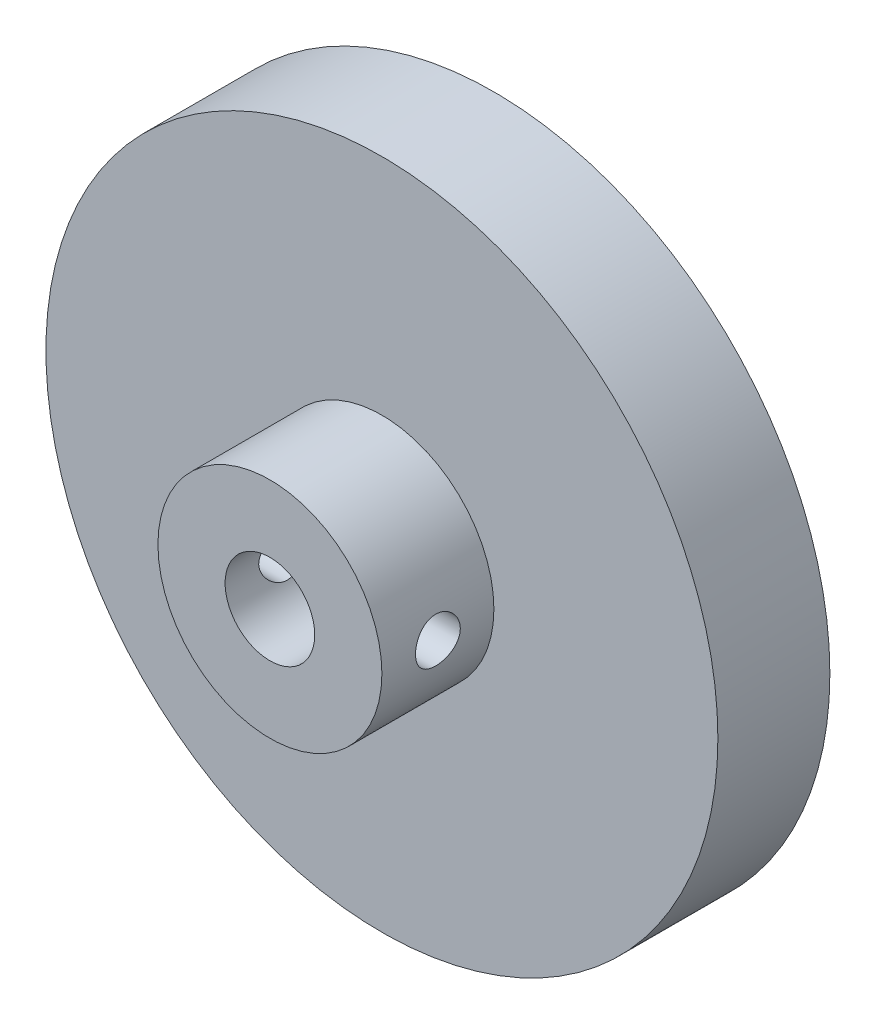
ISO-10303-21;
HEADER;
FILE_DESCRIPTION(('STEP AP214'),'2;1');
FILE_NAME('part.step','',(''),(''),'','','');
FILE_SCHEMA(('AUTOMOTIVE_DESIGN { 1 0 10303 214 1 1 1 1 }'));
ENDSEC;
DATA;
#1=APPLICATION_CONTEXT('core data for automotive mechanical design processes');
#2=APPLICATION_PROTOCOL_DEFINITION('international standard','automotive_design',2000,#1);
#3=PRODUCT_CONTEXT('',#1,'mechanical');
#4=PRODUCT('Part','Part','',(#3));
#5=PRODUCT_RELATED_PRODUCT_CATEGORY('part','',(#4));
#6=PRODUCT_DEFINITION_FORMATION('','',#4);
#7=PRODUCT_DEFINITION_CONTEXT('part definition',#1,'design');
#8=PRODUCT_DEFINITION('design','',#6,#7);
#9=PRODUCT_DEFINITION_SHAPE('','',#8);
#10=(LENGTH_UNIT() NAMED_UNIT(*) SI_UNIT(.MILLI.,.METRE.));
#11=(NAMED_UNIT(*) PLANE_ANGLE_UNIT() SI_UNIT($,.RADIAN.));
#12=(NAMED_UNIT(*) SI_UNIT($,.STERADIAN.) SOLID_ANGLE_UNIT());
#13=UNCERTAINTY_MEASURE_WITH_UNIT(LENGTH_MEASURE(1.E-05),#10,'distance_accuracy_value','');
#14=(GEOMETRIC_REPRESENTATION_CONTEXT(3) GLOBAL_UNCERTAINTY_ASSIGNED_CONTEXT((#13)) GLOBAL_UNIT_ASSIGNED_CONTEXT((#10,
#11,#12)) REPRESENTATION_CONTEXT('',''));
#15=CARTESIAN_POINT('',(0.,0.,0.));
#16=DIRECTION('',(0.,0.,1.));
#17=DIRECTION('',(1.,0.,0.));
#18=AXIS2_PLACEMENT_3D('',#15,#16,#17);
#19=CARTESIAN_POINT('',(0.,0.,20.));
#20=DIRECTION('',(0.,0.,-1.));
#21=DIRECTION('',(-1.,0.,0.));
#22=AXIS2_PLACEMENT_3D('',#19,#20,#21);
#23=CYLINDRICAL_SURFACE('',#22,10.);
#24=CARTESIAN_POINT('',(0.,0.,20.));
#25=DIRECTION('',(0.,0.,1.));
#26=DIRECTION('',(1.,0.,0.));
#27=AXIS2_PLACEMENT_3D('',#24,#25,#26);
#28=CIRCLE('',#27,10.);
#29=CARTESIAN_POINT('',(10.,0.,20.));
#30=VERTEX_POINT('',#29);
#31=EDGE_CURVE('E52',#30,#30,#28,.T.);
#32=ORIENTED_EDGE('',*,*,#31,.F.);
#33=EDGE_LOOP('',(#32));
#34=FACE_BOUND('',#33,.T.);
#35=CARTESIAN_POINT('',(0.,0.,10.));
#36=DIRECTION('',(0.,0.,1.));
#37=DIRECTION('',(1.,0.,0.));
#38=AXIS2_PLACEMENT_3D('',#35,#36,#37);
#39=CIRCLE('',#38,10.);
#40=CARTESIAN_POINT('',(10.,0.,10.));
#41=VERTEX_POINT('',#40);
#42=EDGE_CURVE('E10',#41,#41,#39,.T.);
#43=ORIENTED_EDGE('',*,*,#42,.T.);
#44=EDGE_LOOP('',(#43));
#45=FACE_BOUND('',#44,.T.);
#46=CARTESIAN_POINT('',(-10.,0.,17.));
#47=CARTESIAN_POINT('',(-9.99999795161742,0.111153813585266,16.9999959110033));
#48=CARTESIAN_POINT('',(-9.99812770356462,0.222359320403044,16.9907023140647));
#49=CARTESIAN_POINT('',(-9.99084731246463,0.441627015378038,16.9538029997695));
#50=CARTESIAN_POINT('',(-9.98543435720372,0.549686635082711,16.926182734397));
#51=CARTESIAN_POINT('',(-9.97167298556573,0.759460610526624,16.8535174527584));
#52=CARTESIAN_POINT('',(-9.96332738153436,0.861180935866266,16.8084891263106));
#53=CARTESIAN_POINT('',(-9.94460796070629,1.05561597772845,16.7023355049774));
#54=CARTESIAN_POINT('',(-9.93423426471414,1.14833123015162,16.6412111687856));
#55=CARTESIAN_POINT('',(-9.9124433065994,1.32338695462973,16.5037230114171));
#56=CARTESIAN_POINT('',(-9.90101491008695,1.40558790231705,16.4271832892176));
#57=CARTESIAN_POINT('',(-9.87848360905177,1.55607351321605,16.2614151672166));
#58=CARTESIAN_POINT('',(-9.86738073000848,1.62435708954085,16.1721857773298));
#59=CARTESIAN_POINT('',(-9.8466488362523,1.74566350669524,15.9825676139763));
#60=CARTESIAN_POINT('',(-9.83703414729892,1.79854187773173,15.8820847124073));
#61=CARTESIAN_POINT('',(-9.82052536116836,1.88661133316062,15.6734363619918));
#62=CARTESIAN_POINT('',(-9.81363099523923,1.92180416487447,15.5652716733073));
#63=CARTESIAN_POINT('',(-9.80345610504409,1.97305059976965,15.3458312721842));
#64=CARTESIAN_POINT('',(-9.80012940214375,1.98934899591755,15.2346149117155));
#65=CARTESIAN_POINT('',(-9.79732750121254,2.00310425545224,15.0109803572713));
#66=CARTESIAN_POINT('',(-9.79785190935681,2.000563045427,14.8985622873597));
#67=CARTESIAN_POINT('',(-9.80265102296369,1.97690914620364,14.677506423958));
#68=CARTESIAN_POINT('',(-9.80686905717527,1.95607708048781,14.5688371887454));
#69=CARTESIAN_POINT('',(-9.81849092320002,1.8968757692461,14.356567846674));
#70=CARTESIAN_POINT('',(-9.82589490715558,1.85850568620136,14.252967982162));
#71=CARTESIAN_POINT('',(-9.84311237000816,1.76504956734944,14.0529694765928));
#72=CARTESIAN_POINT('',(-9.85294179627409,1.70985230246423,13.9566242408617));
#73=CARTESIAN_POINT('',(-9.87389237546124,1.58438714914536,13.7744583000544));
#74=CARTESIAN_POINT('',(-9.88501367676732,1.51411752871366,13.6886388062977));
#75=CARTESIAN_POINT('',(-9.90754042482924,1.35899986912117,13.5283411950861));
#76=CARTESIAN_POINT('',(-9.9189473842181,1.27391232242489,13.4540948642817));
#77=CARTESIAN_POINT('',(-9.94057697428817,1.09237004812402,13.3208923073976));
#78=CARTESIAN_POINT('',(-9.95079958977947,0.99591517475878,13.2619362774128));
#79=CARTESIAN_POINT('',(-9.96893380321774,0.794118773757843,13.1609449815481));
#80=CARTESIAN_POINT('',(-9.97684177696544,0.688763639170601,13.1189362127109));
#81=CARTESIAN_POINT('',(-9.98942817975716,0.472297952897331,13.0532790519229));
#82=CARTESIAN_POINT('',(-9.99410700001063,0.3611881001449,13.0296284358527));
#83=CARTESIAN_POINT('',(-9.99965343733735,0.138358811254302,13.0016870924114));
#84=CARTESIAN_POINT('',(-10.0005834930494,0.0266806566511538,12.9970791609195));
#85=CARTESIAN_POINT('',(-9.99870103860205,-0.195849868385427,13.0064997178844));
#86=CARTESIAN_POINT('',(-9.99588873882892,-0.306702284887585,13.0205271587052));
#87=CARTESIAN_POINT('',(-9.98687664016035,-0.52341131989308,13.0665567470879));
#88=CARTESIAN_POINT('',(-9.98070752808413,-0.629303896679805,13.0983961369958));
#89=CARTESIAN_POINT('',(-9.96567104122065,-0.834247254999333,13.1789679653116));
#90=CARTESIAN_POINT('',(-9.95680346428454,-0.933297523275078,13.2277016693537));
#91=CARTESIAN_POINT('',(-9.93719823066589,-1.12308234737243,13.3413649813026));
#92=CARTESIAN_POINT('',(-9.92643900874104,-1.21370025350437,13.4064855620779));
#93=CARTESIAN_POINT('',(-9.90429469659765,-1.38283603823841,13.5508183824146));
#94=CARTESIAN_POINT('',(-9.89290953936776,-1.46135261786152,13.6300321327997));
#95=CARTESIAN_POINT('',(-9.8705860711393,-1.60528118154835,13.8017467037822));
#96=CARTESIAN_POINT('',(-9.85965720466609,-1.67047540489731,13.8944314884427));
#97=CARTESIAN_POINT('',(-9.83968383592389,-1.78437084010241,14.0896227227134));
#98=CARTESIAN_POINT('',(-9.83063925826685,-1.8330727118458,14.1921287791471));
#99=CARTESIAN_POINT('',(-9.81553481168766,-1.91230368316392,14.4035364922991));
#100=CARTESIAN_POINT('',(-9.80945949744373,-1.9429269995821,14.5124016824206));
#101=CARTESIAN_POINT('',(-9.8009487358405,-1.98541730325439,14.7338669069818));
#102=CARTESIAN_POINT('',(-9.79851281382223,-1.99728673645022,14.8464664524187));
#103=CARTESIAN_POINT('',(-9.79758299262758,-2.00184182173494,15.0700177290886));
#104=CARTESIAN_POINT('',(-9.79901838378602,-1.99487157614179,15.180962297854));
#105=CARTESIAN_POINT('',(-9.80551146969228,-1.96270460820012,15.4000632998101));
#106=CARTESIAN_POINT('',(-9.81056913534338,-1.9375080322586,15.5082197553896));
#107=CARTESIAN_POINT('',(-9.82370528438317,-1.86975713699791,15.7184554224811));
#108=CARTESIAN_POINT('',(-9.83177642037661,-1.82724501343469,15.8205487210048));
#109=CARTESIAN_POINT('',(-9.85003429948341,-1.72610928920321,16.0162074414689));
#110=CARTESIAN_POINT('',(-9.86022121997788,-1.66748433754976,16.1097721474503));
#111=CARTESIAN_POINT('',(-9.88177921046451,-1.53461182957283,16.2874311443006));
#112=CARTESIAN_POINT('',(-9.89316745819399,-1.46011577447036,16.3713375305352));
#113=CARTESIAN_POINT('',(-9.91572163743909,-1.29812873802628,16.5255724110583));
#114=CARTESIAN_POINT('',(-9.92688751726369,-1.21063477430667,16.5958977806345));
#115=CARTESIAN_POINT('',(-9.94787664775943,-1.02403525817649,16.7216692878929));
#116=CARTESIAN_POINT('',(-9.95768462438492,-0.924817768859669,16.77695200656));
#117=CARTESIAN_POINT('',(-9.9747025017,-0.718332721881465,16.8699722451932));
#118=CARTESIAN_POINT('',(-9.98191474277232,-0.611072521726253,16.907725579065));
#119=CARTESIAN_POINT('',(-9.99152745190741,-0.41964297784756,16.9573038960894));
#120=CARTESIAN_POINT('',(-9.99468606316903,-0.33656332802757,16.9732863874155));
#121=CARTESIAN_POINT('',(-9.99892308279786,-0.168999050420134,16.9946358247167));
#122=CARTESIAN_POINT('',(-10.0000015574631,-0.0845144674972381,17.0000031090195));
#123=CARTESIAN_POINT('',(-10.,0.,17.));
#124=B_SPLINE_CURVE_WITH_KNOTS('',3,(#46,#47,#48,#49,#50,#51,#52,#53,#54,#55,#56,#57,#58,#59,
#60,#61,#62,#63,#64,#65,#66,#67,#68,#69,#70,#71,#72,#73,#74,#75,#76,#77,#78,#79,#80,#81,#82,#83,
#84,#85,#86,#87,#88,#89,#90,#91,#92,#93,#94,#95,#96,#97,#98,#99,#100,#101,#102,#103,#104,#105,
#106,#107,#108,#109,#110,#111,#112,#113,#114,#115,#116,#117,#118,#119,#120,#121,#122,#123),
.UNSPECIFIED.,.T.,.F.,(4,2,2,2,2,2,2,2,2,2,2,2,2,2,2,2,2,2,2,2,2,2,2,2,2,2,2,2,2,2,2,2,2,2,2,2,
2,2,4),(0.,0.333152261322516,0.666569301382645,0.99966747050068,1.33274580446172,
1.66986534022437,2.00701119349473,2.34722390011845,2.68740298730395,3.02312370207174,
3.3588100856245,3.68943454012556,4.02007478507459,4.35294980407185,4.68586309499341,
5.02476504982701,5.3636713507964,5.70310549708047,6.04249851396072,6.3762147135253,
6.70991215315735,7.04060907901447,7.37133078432045,7.70610132066717,8.0409077669186,
8.38081257158451,8.72070377446932,9.05880762065446,9.39686736660829,9.72879445135402,
10.0607188698522,10.3918392250622,10.7229873516373,11.0597615247829,11.3966130906586,
11.7369899335127,12.0770591103504,12.3303755057979,12.5836838274199),.UNSPECIFIED.);
#125=CARTESIAN_POINT('',(-10.,0.,17.));
#126=VERTEX_POINT('',#125);
#127=EDGE_CURVE('E75',#126,#126,#124,.T.);
#128=ORIENTED_EDGE('',*,*,#127,.F.);
#129=EDGE_LOOP('',(#128));
#130=FACE_BOUND('',#129,.T.);
#131=CARTESIAN_POINT('',(10.,0.,17.));
#132=CARTESIAN_POINT('',(9.99999795161742,-0.111153813585266,16.9999959110033));
#133=CARTESIAN_POINT('',(9.99812770356462,-0.222359320403045,16.9907023140647));
#134=CARTESIAN_POINT('',(9.99084731246463,-0.441627015378038,16.9538029997695));
#135=CARTESIAN_POINT('',(9.98543435720372,-0.549686635082711,16.926182734397));
#136=CARTESIAN_POINT('',(9.97167298556573,-0.759460610526624,16.8535174527584));
#137=CARTESIAN_POINT('',(9.96332738153436,-0.861180935866266,16.8084891263106));
#138=CARTESIAN_POINT('',(9.94460796070629,-1.05561597772845,16.7023355049774));
#139=CARTESIAN_POINT('',(9.93423426471414,-1.14833123015162,16.6412111687856));
#140=CARTESIAN_POINT('',(9.9124433065994,-1.32338695462973,16.5037230114171));
#141=CARTESIAN_POINT('',(9.90101491008695,-1.40558790231705,16.4271832892176));
#142=CARTESIAN_POINT('',(9.87848360905177,-1.55607351321605,16.2614151672166));
#143=CARTESIAN_POINT('',(9.86738073000848,-1.62435708954085,16.1721857773298));
#144=CARTESIAN_POINT('',(9.8466488362523,-1.74566350669524,15.9825676139763));
#145=CARTESIAN_POINT('',(9.83703414729892,-1.79854187773173,15.8820847124073));
#146=CARTESIAN_POINT('',(9.82052536116836,-1.88661133316062,15.6734363619918));
#147=CARTESIAN_POINT('',(9.81363099523923,-1.92180416487447,15.5652716733073));
#148=CARTESIAN_POINT('',(9.80345610504409,-1.97305059976965,15.3458312721842));
#149=CARTESIAN_POINT('',(9.80012940214375,-1.98934899591755,15.2346149117155));
#150=CARTESIAN_POINT('',(9.79732750121254,-2.00310425545224,15.0109803572713));
#151=CARTESIAN_POINT('',(9.79785190935681,-2.000563045427,14.8985622873597));
#152=CARTESIAN_POINT('',(9.80265102296369,-1.97690914620364,14.677506423958));
#153=CARTESIAN_POINT('',(9.80686905717527,-1.95607708048781,14.5688371887454));
#154=CARTESIAN_POINT('',(9.81849092320002,-1.8968757692461,14.356567846674));
#155=CARTESIAN_POINT('',(9.82589490715558,-1.85850568620136,14.252967982162));
#156=CARTESIAN_POINT('',(9.84311237000816,-1.76504956734944,14.0529694765928));
#157=CARTESIAN_POINT('',(9.85294179627409,-1.70985230246423,13.9566242408617));
#158=CARTESIAN_POINT('',(9.87389237546124,-1.58438714914536,13.7744583000544));
#159=CARTESIAN_POINT('',(9.88501367676732,-1.51411752871366,13.6886388062977));
#160=CARTESIAN_POINT('',(9.90754042482924,-1.35899986912117,13.5283411950861));
#161=CARTESIAN_POINT('',(9.9189473842181,-1.27391232242489,13.4540948642817));
#162=CARTESIAN_POINT('',(9.94057697428817,-1.09237004812402,13.3208923073976));
#163=CARTESIAN_POINT('',(9.95079958977947,-0.995915174758779,13.2619362774128));
#164=CARTESIAN_POINT('',(9.96893380321774,-0.794118773757842,13.1609449815481));
#165=CARTESIAN_POINT('',(9.97684177696544,-0.688763639170601,13.1189362127109));
#166=CARTESIAN_POINT('',(9.98942817975716,-0.472297952897331,13.0532790519229));
#167=CARTESIAN_POINT('',(9.99410700001063,-0.3611881001449,13.0296284358527));
#168=CARTESIAN_POINT('',(9.99965343733735,-0.138358811254302,13.0016870924114));
#169=CARTESIAN_POINT('',(10.0005834930494,-0.0266806566511532,12.9970791609195));
#170=CARTESIAN_POINT('',(9.99870103860205,0.195849868385427,13.0064997178844));
#171=CARTESIAN_POINT('',(9.99588873882892,0.306702284887585,13.0205271587052));
#172=CARTESIAN_POINT('',(9.98687664016035,0.52341131989308,13.0665567470879));
#173=CARTESIAN_POINT('',(9.98070752808413,0.629303896679805,13.0983961369958));
#174=CARTESIAN_POINT('',(9.96567104122065,0.834247254999333,13.1789679653116));
#175=CARTESIAN_POINT('',(9.95680346428454,0.933297523275078,13.2277016693537));
#176=CARTESIAN_POINT('',(9.93719823066589,1.12308234737243,13.3413649813026));
#177=CARTESIAN_POINT('',(9.92643900874103,1.21370025350438,13.4064855620779));
#178=CARTESIAN_POINT('',(9.90429469659765,1.38283603823841,13.5508183824146));
#179=CARTESIAN_POINT('',(9.89290953936776,1.46135261786152,13.6300321327997));
#180=CARTESIAN_POINT('',(9.8705860711393,1.60528118154835,13.8017467037822));
#181=CARTESIAN_POINT('',(9.85965720466609,1.67047540489731,13.8944314884427));
#182=CARTESIAN_POINT('',(9.83968383592389,1.78437084010241,14.0896227227134));
#183=CARTESIAN_POINT('',(9.83063925826685,1.8330727118458,14.1921287791471));
#184=CARTESIAN_POINT('',(9.81553481168766,1.91230368316392,14.4035364922991));
#185=CARTESIAN_POINT('',(9.80945949744373,1.9429269995821,14.5124016824206));
#186=CARTESIAN_POINT('',(9.8009487358405,1.98541730325439,14.7338669069818));
#187=CARTESIAN_POINT('',(9.79851281382223,1.99728673645022,14.8464664524187));
#188=CARTESIAN_POINT('',(9.79758299262758,2.00184182173494,15.0700177290886));
#189=CARTESIAN_POINT('',(9.79901838378602,1.99487157614179,15.180962297854));
#190=CARTESIAN_POINT('',(9.80551146969228,1.96270460820012,15.40006329981));
#191=CARTESIAN_POINT('',(9.81056913534338,1.9375080322586,15.5082197553896));
#192=CARTESIAN_POINT('',(9.82370528438317,1.86975713699791,15.7184554224811));
#193=CARTESIAN_POINT('',(9.83177642037661,1.82724501343469,15.8205487210048));
#194=CARTESIAN_POINT('',(9.85003429948341,1.72610928920321,16.0162074414689));
#195=CARTESIAN_POINT('',(9.86022121997788,1.66748433754976,16.1097721474503));
#196=CARTESIAN_POINT('',(9.88177921046451,1.53461182957283,16.2874311443006));
#197=CARTESIAN_POINT('',(9.89316745819399,1.46011577447036,16.3713375305352));
#198=CARTESIAN_POINT('',(9.91572163743909,1.29812873802628,16.5255724110583));
#199=CARTESIAN_POINT('',(9.92688751726369,1.21063477430667,16.5958977806345));
#200=CARTESIAN_POINT('',(9.94787664775943,1.02403525817649,16.7216692878929));
#201=CARTESIAN_POINT('',(9.95768462438492,0.924817768859669,16.77695200656));
#202=CARTESIAN_POINT('',(9.9747025017,0.718332721881465,16.8699722451932));
#203=CARTESIAN_POINT('',(9.98191474277232,0.611072521726253,16.907725579065));
#204=CARTESIAN_POINT('',(9.99152745190741,0.41964297784756,16.9573038960894));
#205=CARTESIAN_POINT('',(9.99468606316904,0.33656332802757,16.9732863874155));
#206=CARTESIAN_POINT('',(9.99892308279786,0.168999050420134,16.9946358247167));
#207=CARTESIAN_POINT('',(10.0000015574631,0.0845144674972381,17.0000031090195));
#208=CARTESIAN_POINT('',(10.,0.,17.));
#209=B_SPLINE_CURVE_WITH_KNOTS('',3,(#131,#132,#133,#134,#135,#136,#137,#138,#139,#140,#141,
#142,#143,#144,#145,#146,#147,#148,#149,#150,#151,#152,#153,#154,#155,#156,#157,#158,#159,#160,
#161,#162,#163,#164,#165,#166,#167,#168,#169,#170,#171,#172,#173,#174,#175,#176,#177,#178,#179,
#180,#181,#182,#183,#184,#185,#186,#187,#188,#189,#190,#191,#192,#193,#194,#195,#196,#197,#198,
#199,#200,#201,#202,#203,#204,#205,#206,#207,#208),.UNSPECIFIED.,.T.,.F.,(4,2,2,2,2,2,2,2,2,2,2,
2,2,2,2,2,2,2,2,2,2,2,2,2,2,2,2,2,2,2,2,2,2,2,2,2,2,2,4),(0.,0.333152261322517,
0.666569301382645,0.999667470500681,1.33274580446172,1.66986534022437,2.00701119349473,
2.34722390011845,2.68740298730395,3.02312370207174,3.3588100856245,3.68943454012556,
4.02007478507459,4.35294980407185,4.68586309499341,5.02476504982701,5.3636713507964,
5.70310549708047,6.04249851396072,6.3762147135253,6.70991215315735,7.04060907901446,
7.37133078432045,7.70610132066717,8.0409077669186,8.38081257158451,8.72070377446933,
9.05880762065446,9.39686736660829,9.72879445135402,10.0607188698522,10.3918392250622,
10.7229873516373,11.0597615247829,11.3966130906586,11.7369899335127,12.0770591103504,
12.3303755057979,12.5836838274199),.UNSPECIFIED.);
#210=CARTESIAN_POINT('',(10.,0.,17.));
#211=VERTEX_POINT('',#210);
#212=EDGE_CURVE('E81',#211,#211,#209,.T.);
#213=ORIENTED_EDGE('',*,*,#212,.F.);
#214=EDGE_LOOP('',(#213));
#215=FACE_BOUND('',#214,.T.);
#216=ADVANCED_FACE('F31',(#34,#45,#130,#215),#23,.T.);
#217=CARTESIAN_POINT('',(0.,0.,20.));
#218=DIRECTION('',(0.,0.,-1.));
#219=DIRECTION('',(-1.,0.,0.));
#220=AXIS2_PLACEMENT_3D('',#217,#218,#219);
#221=CYLINDRICAL_SURFACE('',#220,4.);
#222=CARTESIAN_POINT('',(4.,0.,17.));
#223=CARTESIAN_POINT('',(3.99999426810082,-0.105143925902467,16.9999933953656));
#224=CARTESIAN_POINT('',(3.99580982039513,-0.210413199395125,16.9916598537579));
#225=CARTESIAN_POINT('',(3.97948312074314,-0.417840470537792,16.9586942393169));
#226=CARTESIAN_POINT('',(3.96732575657839,-0.519992173427259,16.9340312140044));
#227=CARTESIAN_POINT('',(3.93632558806751,-0.717867089760897,16.8696123827667));
#228=CARTESIAN_POINT('',(3.91750878355075,-0.813613605878292,16.8299152315041));
#229=CARTESIAN_POINT('',(3.87491553031523,-0.996945233613197,16.73685875727));
#230=CARTESIAN_POINT('',(3.8511394726705,-1.08453098798012,16.6835005115023));
#231=CARTESIAN_POINT('',(3.79912516516124,-1.25501563552382,16.5609655010294));
#232=CARTESIAN_POINT('',(3.77070398255074,-1.33731042224422,16.4910270415207));
#233=CARTESIAN_POINT('',(3.71319940493486,-1.48955888973396,16.3389570415059));
#234=CARTESIAN_POINT('',(3.68411552418069,-1.55950316621353,16.2568162964551));
#235=CARTESIAN_POINT('',(3.62597902394695,-1.69050400090055,16.0750333009532));
#236=CARTESIAN_POINT('',(3.59710373940264,-1.75045067110327,15.9745278033082));
#237=CARTESIAN_POINT('',(3.54571957544641,-1.85233645378139,15.7632653280276));
#238=CARTESIAN_POINT('',(3.52320615213979,-1.89428842993267,15.6525157425545));
#239=CARTESIAN_POINT('',(3.48915734075617,-1.95626488437718,15.4306697891562));
#240=CARTESIAN_POINT('',(3.47704543167427,-1.97745171416088,15.3199910958652));
#241=CARTESIAN_POINT('',(3.46363779897055,-2.00085398661769,15.096042324441));
#242=CARTESIAN_POINT('',(3.46233138686576,-2.00308817674615,14.9827749182577));
#243=CARTESIAN_POINT('',(3.47021860514497,-1.98937457434459,14.7714279513693));
#244=CARTESIAN_POINT('',(3.47817527324027,-1.97556911907364,14.6731519375539));
#245=CARTESIAN_POINT('',(3.50152457467701,-1.93387969811386,14.4805561812539));
#246=CARTESIAN_POINT('',(3.51691957663553,-1.9059912477953,14.3862377093894));
#247=CARTESIAN_POINT('',(3.55374952825482,-1.83641956077201,14.2015417348687));
#248=CARTESIAN_POINT('',(3.57531681327997,-1.79443013423199,14.1113072024284));
#249=CARTESIAN_POINT('',(3.62206808562807,-1.698083375336,13.93873141482));
#250=CARTESIAN_POINT('',(3.64725369560381,-1.64372048762493,13.8563937287998));
#251=CARTESIAN_POINT('',(3.70226315806572,-1.51613210982558,13.6909574945135));
#252=CARTESIAN_POINT('',(3.73227020473492,-1.44138891673856,13.6090862528477));
#253=CARTESIAN_POINT('',(3.79095246600814,-1.27911115748275,13.4585291628182));
#254=CARTESIAN_POINT('',(3.81962703917602,-1.19157051314857,13.3898496159322));
#255=CARTESIAN_POINT('',(3.87403974565928,-1.0010330116637,13.2646286779405));
#256=CARTESIAN_POINT('',(3.89957968324015,-0.897507183198817,13.2087990551085));
#257=CARTESIAN_POINT('',(3.94315762242485,-0.680932430977594,13.115805941914));
#258=CARTESIAN_POINT('',(3.96120157887106,-0.567891152530552,13.0786276299697));
#259=CARTESIAN_POINT('',(3.98648667482871,-0.345532983321405,13.0270491925666));
#260=CARTESIAN_POINT('',(3.9944987660262,-0.236683061096653,13.0110175285064));
#261=CARTESIAN_POINT('',(4.00146026918207,-0.0175591998987037,12.997070537731));
#262=CARTESIAN_POINT('',(4.00041397442637,0.0927140397398169,12.9991466287211));
#263=CARTESIAN_POINT('',(3.9898238450687,0.302465943971973,13.0204133768375));
#264=CARTESIAN_POINT('',(3.98094491376337,0.40211881609986,13.03826506546));
#265=CARTESIAN_POINT('',(3.95644342629681,0.596813784603882,13.0884761437902));
#266=CARTESIAN_POINT('',(3.94082012668824,0.691855371382173,13.120837132907));
#267=CARTESIAN_POINT('',(3.90368502827176,0.877777216899145,13.1999969328661));
#268=CARTESIAN_POINT('',(3.88201763539262,0.968460794011606,13.2471821002326));
#269=CARTESIAN_POINT('',(3.83487948634835,1.14092272339854,13.3542150712931));
#270=CARTESIAN_POINT('',(3.80940711133877,1.22269725955318,13.4140682691908));
#271=CARTESIAN_POINT('',(3.75416442672396,1.38353537857843,13.5515208506614));
#272=CARTESIAN_POINT('',(3.72421769686998,1.46154415563805,13.6302857368903));
#273=CARTESIAN_POINT('',(3.6652478321764,1.60371264223771,13.7998503025555));
#274=CARTESIAN_POINT('',(3.63622534800094,1.66786277142375,13.8906582376958));
#275=CARTESIAN_POINT('',(3.58102384412979,1.78341582895803,14.0872873083459));
#276=CARTESIAN_POINT('',(3.55505059178121,1.8340509916005,14.193622532189));
#277=CARTESIAN_POINT('',(3.51148144588269,1.91616565186941,14.4150201351499));
#278=CARTESIAN_POINT('',(3.493874764435,1.94766983173403,14.5300710529338));
#279=CARTESIAN_POINT('',(3.47123002051604,1.98772337493374,14.7538204457694));
#280=CARTESIAN_POINT('',(3.4651476693013,1.9981859928109,14.8620685068705));
#281=CARTESIAN_POINT('',(3.46330709283206,2.0013783087524,15.078894134329));
#282=CARTESIAN_POINT('',(3.4675443925278,1.99411569324648,15.1874715374757));
#283=CARTESIAN_POINT('',(3.48475724102153,1.96385225118662,15.3909670030669));
#284=CARTESIAN_POINT('',(3.49686188965317,1.94241662868607,15.4862009402895));
#285=CARTESIAN_POINT('',(3.52742032375305,1.88635071644882,15.6716162388487));
#286=CARTESIAN_POINT('',(3.54587615139337,1.85171618231984,15.7617959641841));
#287=CARTESIAN_POINT('',(3.58857060729071,1.76763149060113,15.9412497019731));
#288=CARTESIAN_POINT('',(3.61311444791841,1.7173422756314,16.0300558036581));
#289=CARTESIAN_POINT('',(3.66470663269721,1.60430194327478,16.1985490723625));
#290=CARTESIAN_POINT('',(3.69175627591221,1.54154434248312,16.2782314610422));
#291=CARTESIAN_POINT('',(3.74924646316184,1.39640665332275,16.4362839647094));
#292=CARTESIAN_POINT('',(3.77969966613256,1.31256884599452,16.5133182047006));
#293=CARTESIAN_POINT('',(3.83755504519861,1.13230961246639,16.6525259668705));
#294=CARTESIAN_POINT('',(3.8649555725239,1.03588144661039,16.7146914789398));
#295=CARTESIAN_POINT('',(3.91396019133075,0.831863193565892,16.8224727254241));
#296=CARTESIAN_POINT('',(3.93552192987866,0.724199007553461,16.8679683384729));
#297=CARTESIAN_POINT('',(3.97002682597974,0.501484202276174,16.9396163355148));
#298=CARTESIAN_POINT('',(3.98299446726136,0.386455599178201,16.9658236936114));
#299=CARTESIAN_POINT('',(3.99390923826956,0.225203892981791,16.9877948221715));
#300=CARTESIAN_POINT('',(3.99618730680502,0.18032375888313,16.9923652817327));
#301=CARTESIAN_POINT('',(3.99923393953631,0.0903034636101835,16.9984693310282));
#302=CARTESIAN_POINT('',(4.00000246206762,0.0451632952932571,17.0000028369404));
#303=CARTESIAN_POINT('',(4.,0.,17.));
#304=B_SPLINE_CURVE_WITH_KNOTS('',3,(#222,#223,#224,#225,#226,#227,#228,#229,#230,#231,#232,
#233,#234,#235,#236,#237,#238,#239,#240,#241,#242,#243,#244,#245,#246,#247,#248,#249,#250,#251,
#252,#253,#254,#255,#256,#257,#258,#259,#260,#261,#262,#263,#264,#265,#266,#267,#268,#269,#270,
#271,#272,#273,#274,#275,#276,#277,#278,#279,#280,#281,#282,#283,#284,#285,#286,#287,#288,#289,
#290,#291,#292,#293,#294,#295,#296,#297,#298,#299,#300,#301,#302,#303),.UNSPECIFIED.,.T.,.F.,(4,
2,2,2,2,2,2,2,2,2,2,2,2,2,2,2,2,2,2,2,2,2,2,2,2,2,2,2,2,2,2,2,2,2,2,2,2,2,2,2,4),(0.,
0.315248514840585,0.631096299418395,0.945724310984596,1.26032752116314,1.59396351743618,
1.92785247530807,2.28763452861505,2.64715895796562,2.98516024280459,3.32282714658041,
3.62011424818641,3.91749607851357,4.22180480336975,4.52625042520443,4.86929882667757,
5.21251069197373,5.57166044428881,5.93052433824559,6.25966580942691,6.58865129022952,
6.89213813012244,7.19565843261863,7.50785712055797,7.82018901496678,8.16319221288838,
8.50643177230863,8.86629364323451,9.22569023890901,9.55058615006093,9.87534119729357,
10.1691586049771,10.463070575767,10.7767291356057,11.0905512228726,11.4425048551434,
11.7946476676249,12.1492802732705,12.502898172423,12.6383056026783,12.7737167702213),.UNSPECIFIED.);
#305=CARTESIAN_POINT('',(4.,0.,17.));
#306=VERTEX_POINT('',#305);
#307=EDGE_CURVE('E56',#306,#306,#304,.T.);
#308=ORIENTED_EDGE('',*,*,#307,.T.);
#309=EDGE_LOOP('',(#308));
#310=FACE_BOUND('',#309,.T.);
#311=CARTESIAN_POINT('',(0.,0.,20.));
#312=DIRECTION('',(0.,0.,1.));
#313=DIRECTION('',(1.,0.,0.));
#314=AXIS2_PLACEMENT_3D('',#311,#312,#313);
#315=CIRCLE('',#314,4.);
#316=CARTESIAN_POINT('',(4.,0.,20.));
#317=VERTEX_POINT('',#316);
#318=EDGE_CURVE('E119',#317,#317,#315,.T.);
#319=ORIENTED_EDGE('',*,*,#318,.T.);
#320=EDGE_LOOP('',(#319));
#321=FACE_BOUND('',#320,.T.);
#322=CARTESIAN_POINT('',(0.,0.,10.));
#323=DIRECTION('',(0.,0.,1.));
#324=DIRECTION('',(1.,0.,0.));
#325=AXIS2_PLACEMENT_3D('',#322,#323,#324);
#326=CIRCLE('',#325,4.);
#327=CARTESIAN_POINT('',(4.,0.,10.));
#328=VERTEX_POINT('',#327);
#329=EDGE_CURVE('E123',#328,#328,#326,.T.);
#330=ORIENTED_EDGE('',*,*,#329,.F.);
#331=EDGE_LOOP('',(#330));
#332=FACE_BOUND('',#331,.T.);
#333=CARTESIAN_POINT('',(-4.,0.,17.));
#334=CARTESIAN_POINT('',(-3.99999426810082,0.105143925902467,16.9999933953656));
#335=CARTESIAN_POINT('',(-3.99580982039513,0.210413199395125,16.9916598537579));
#336=CARTESIAN_POINT('',(-3.97948312074314,0.417840470537792,16.9586942393169));
#337=CARTESIAN_POINT('',(-3.96732575657839,0.519992173427259,16.9340312140044));
#338=CARTESIAN_POINT('',(-3.93632558806751,0.717867089760897,16.8696123827667));
#339=CARTESIAN_POINT('',(-3.91750878355075,0.813613605878292,16.8299152315041));
#340=CARTESIAN_POINT('',(-3.87491553031523,0.996945233613197,16.73685875727));
#341=CARTESIAN_POINT('',(-3.8511394726705,1.08453098798012,16.6835005115023));
#342=CARTESIAN_POINT('',(-3.79912516516124,1.25501563552382,16.5609655010294));
#343=CARTESIAN_POINT('',(-3.77070398255074,1.33731042224422,16.4910270415207));
#344=CARTESIAN_POINT('',(-3.71319940493486,1.48955888973396,16.3389570415059));
#345=CARTESIAN_POINT('',(-3.68411552418069,1.55950316621353,16.2568162964551));
#346=CARTESIAN_POINT('',(-3.62597902394695,1.69050400090055,16.0750333009532));
#347=CARTESIAN_POINT('',(-3.59710373940264,1.75045067110327,15.9745278033082));
#348=CARTESIAN_POINT('',(-3.54571957544641,1.85233645378139,15.7632653280276));
#349=CARTESIAN_POINT('',(-3.52320615213979,1.89428842993267,15.6525157425545));
#350=CARTESIAN_POINT('',(-3.48915734075617,1.95626488437718,15.4306697891562));
#351=CARTESIAN_POINT('',(-3.47704543167427,1.97745171416088,15.3199910958652));
#352=CARTESIAN_POINT('',(-3.46363779897055,2.00085398661769,15.096042324441));
#353=CARTESIAN_POINT('',(-3.46233138686576,2.00308817674615,14.9827749182577));
#354=CARTESIAN_POINT('',(-3.47021860514497,1.98937457434459,14.7714279513693));
#355=CARTESIAN_POINT('',(-3.47817527324027,1.97556911907364,14.6731519375539));
#356=CARTESIAN_POINT('',(-3.50152457467701,1.93387969811386,14.4805561812539));
#357=CARTESIAN_POINT('',(-3.51691957663553,1.9059912477953,14.3862377093894));
#358=CARTESIAN_POINT('',(-3.55374952825482,1.83641956077201,14.2015417348687));
#359=CARTESIAN_POINT('',(-3.57531681327997,1.79443013423199,14.1113072024284));
#360=CARTESIAN_POINT('',(-3.62206808562807,1.698083375336,13.93873141482));
#361=CARTESIAN_POINT('',(-3.64725369560381,1.64372048762493,13.8563937287998));
#362=CARTESIAN_POINT('',(-3.70226315806572,1.51613210982558,13.6909574945135));
#363=CARTESIAN_POINT('',(-3.73227020473492,1.44138891673856,13.6090862528477));
#364=CARTESIAN_POINT('',(-3.79095246600814,1.27911115748275,13.4585291628182));
#365=CARTESIAN_POINT('',(-3.81962703917602,1.19157051314857,13.3898496159322));
#366=CARTESIAN_POINT('',(-3.87403974565928,1.0010330116637,13.2646286779405));
#367=CARTESIAN_POINT('',(-3.89957968324015,0.897507183198817,13.2087990551085));
#368=CARTESIAN_POINT('',(-3.94315762242485,0.680932430977594,13.115805941914));
#369=CARTESIAN_POINT('',(-3.96120157887106,0.567891152530552,13.0786276299697));
#370=CARTESIAN_POINT('',(-3.98648667482871,0.345532983321405,13.0270491925666));
#371=CARTESIAN_POINT('',(-3.9944987660262,0.236683061096653,13.0110175285064));
#372=CARTESIAN_POINT('',(-4.00146026918207,0.0175591998987037,12.997070537731));
#373=CARTESIAN_POINT('',(-4.00041397442637,-0.0927140397398169,12.9991466287211));
#374=CARTESIAN_POINT('',(-3.9898238450687,-0.302465943971973,13.0204133768375));
#375=CARTESIAN_POINT('',(-3.98094491376337,-0.40211881609986,13.03826506546));
#376=CARTESIAN_POINT('',(-3.95644342629681,-0.596813784603882,13.0884761437902));
#377=CARTESIAN_POINT('',(-3.94082012668824,-0.691855371382173,13.120837132907));
#378=CARTESIAN_POINT('',(-3.90368502827176,-0.877777216899145,13.1999969328661));
#379=CARTESIAN_POINT('',(-3.88201763539262,-0.968460794011606,13.2471821002326));
#380=CARTESIAN_POINT('',(-3.83487948634835,-1.14092272339854,13.3542150712931));
#381=CARTESIAN_POINT('',(-3.80940711133877,-1.22269725955318,13.4140682691908));
#382=CARTESIAN_POINT('',(-3.75416442672396,-1.38353537857843,13.5515208506614));
#383=CARTESIAN_POINT('',(-3.72421769686998,-1.46154415563805,13.6302857368903));
#384=CARTESIAN_POINT('',(-3.6652478321764,-1.60371264223771,13.7998503025555));
#385=CARTESIAN_POINT('',(-3.63622534800094,-1.66786277142375,13.8906582376958));
#386=CARTESIAN_POINT('',(-3.58102384412979,-1.78341582895803,14.0872873083459));
#387=CARTESIAN_POINT('',(-3.55505059178121,-1.8340509916005,14.193622532189));
#388=CARTESIAN_POINT('',(-3.51148144588269,-1.91616565186941,14.4150201351499));
#389=CARTESIAN_POINT('',(-3.493874764435,-1.94766983173403,14.5300710529338));
#390=CARTESIAN_POINT('',(-3.47123002051604,-1.98772337493374,14.7538204457694));
#391=CARTESIAN_POINT('',(-3.4651476693013,-1.9981859928109,14.8620685068705));
#392=CARTESIAN_POINT('',(-3.46330709283206,-2.0013783087524,15.078894134329));
#393=CARTESIAN_POINT('',(-3.4675443925278,-1.99411569324648,15.1874715374757));
#394=CARTESIAN_POINT('',(-3.48475724102153,-1.96385225118662,15.3909670030669));
#395=CARTESIAN_POINT('',(-3.49686188965317,-1.94241662868607,15.4862009402895));
#396=CARTESIAN_POINT('',(-3.52742032375305,-1.88635071644882,15.6716162388487));
#397=CARTESIAN_POINT('',(-3.54587615139337,-1.85171618231984,15.7617959641841));
#398=CARTESIAN_POINT('',(-3.58857060729071,-1.76763149060113,15.9412497019731));
#399=CARTESIAN_POINT('',(-3.61311444791841,-1.7173422756314,16.0300558036581));
#400=CARTESIAN_POINT('',(-3.66470663269721,-1.60430194327478,16.1985490723625));
#401=CARTESIAN_POINT('',(-3.69175627591221,-1.54154434248312,16.2782314610422));
#402=CARTESIAN_POINT('',(-3.74924646316184,-1.39640665332275,16.4362839647094));
#403=CARTESIAN_POINT('',(-3.77969966613256,-1.31256884599452,16.5133182047006));
#404=CARTESIAN_POINT('',(-3.83755504519861,-1.13230961246639,16.6525259668705));
#405=CARTESIAN_POINT('',(-3.8649555725239,-1.03588144661039,16.7146914789398));
#406=CARTESIAN_POINT('',(-3.91396019133075,-0.831863193565892,16.8224727254241));
#407=CARTESIAN_POINT('',(-3.93552192987866,-0.724199007553461,16.8679683384729));
#408=CARTESIAN_POINT('',(-3.97002682597974,-0.501484202276174,16.9396163355148));
#409=CARTESIAN_POINT('',(-3.98299446726136,-0.386455599178201,16.9658236936114));
#410=CARTESIAN_POINT('',(-3.99390923826956,-0.225203892981791,16.9877948221715));
#411=CARTESIAN_POINT('',(-3.99618730680502,-0.18032375888313,16.9923652817327));
#412=CARTESIAN_POINT('',(-3.99923393953631,-0.0903034636101835,16.9984693310282));
#413=CARTESIAN_POINT('',(-4.00000246206762,-0.0451632952932571,17.0000028369404));
#414=CARTESIAN_POINT('',(-4.,0.,17.));
#415=B_SPLINE_CURVE_WITH_KNOTS('',3,(#333,#334,#335,#336,#337,#338,#339,#340,#341,#342,#343,
#344,#345,#346,#347,#348,#349,#350,#351,#352,#353,#354,#355,#356,#357,#358,#359,#360,#361,#362,
#363,#364,#365,#366,#367,#368,#369,#370,#371,#372,#373,#374,#375,#376,#377,#378,#379,#380,#381,
#382,#383,#384,#385,#386,#387,#388,#389,#390,#391,#392,#393,#394,#395,#396,#397,#398,#399,#400,
#401,#402,#403,#404,#405,#406,#407,#408,#409,#410,#411,#412,#413,#414),.UNSPECIFIED.,.T.,.F.,(4,
2,2,2,2,2,2,2,2,2,2,2,2,2,2,2,2,2,2,2,2,2,2,2,2,2,2,2,2,2,2,2,2,2,2,2,2,2,2,2,4),(0.,
0.315248514840585,0.631096299418395,0.945724310984596,1.26032752116314,1.59396351743618,
1.92785247530807,2.28763452861505,2.64715895796562,2.98516024280459,3.32282714658041,
3.62011424818641,3.91749607851357,4.22180480336975,4.52625042520443,4.86929882667757,
5.21251069197373,5.57166044428881,5.93052433824559,6.25966580942691,6.58865129022952,
6.89213813012244,7.19565843261863,7.50785712055797,7.82018901496678,8.16319221288838,
8.50643177230863,8.86629364323451,9.22569023890901,9.55058615006093,9.87534119729357,
10.1691586049771,10.463070575767,10.7767291356057,11.0905512228726,11.4425048551434,
11.7946476676249,12.1492802732705,12.502898172423,12.6383056026783,12.7737167702213),.UNSPECIFIED.);
#416=CARTESIAN_POINT('',(-4.,0.,17.));
#417=VERTEX_POINT('',#416);
#418=EDGE_CURVE('E35',#417,#417,#415,.T.);
#419=ORIENTED_EDGE('',*,*,#418,.T.);
#420=EDGE_LOOP('',(#419));
#421=FACE_BOUND('',#420,.T.);
#422=ADVANCED_FACE('F61',(#310,#321,#332,#421),#221,.F.);
#423=CARTESIAN_POINT('',(0.,0.,10.));
#424=DIRECTION('',(0.,0.,-1.));
#425=DIRECTION('',(-1.,0.,0.));
#426=AXIS2_PLACEMENT_3D('',#423,#424,#425);
#427=CYLINDRICAL_SURFACE('',#426,30.);
#428=CARTESIAN_POINT('',(0.,0.,10.));
#429=DIRECTION('',(0.,0.,1.));
#430=DIRECTION('',(1.,0.,0.));
#431=AXIS2_PLACEMENT_3D('',#428,#429,#430);
#432=CIRCLE('',#431,30.);
#433=CARTESIAN_POINT('',(30.,0.,10.));
#434=VERTEX_POINT('',#433);
#435=EDGE_CURVE('E44',#434,#434,#432,.T.);
#436=ORIENTED_EDGE('',*,*,#435,.F.);
#437=EDGE_LOOP('',(#436));
#438=FACE_BOUND('',#437,.T.);
#439=CARTESIAN_POINT('',(0.,0.,0.));
#440=DIRECTION('',(0.,0.,1.));
#441=DIRECTION('',(1.,0.,0.));
#442=AXIS2_PLACEMENT_3D('',#439,#440,#441);
#443=CIRCLE('',#442,30.);
#444=CARTESIAN_POINT('',(30.,0.,0.));
#445=VERTEX_POINT('',#444);
#446=EDGE_CURVE('E49',#445,#445,#443,.T.);
#447=ORIENTED_EDGE('',*,*,#446,.T.);
#448=EDGE_LOOP('',(#447));
#449=FACE_BOUND('',#448,.T.);
#450=ADVANCED_FACE('F33',(#438,#449),#427,.T.);
#451=CARTESIAN_POINT('',(0.,0.,10.));
#452=DIRECTION('',(0.,0.,1.));
#453=DIRECTION('',(1.,0.,0.));
#454=AXIS2_PLACEMENT_3D('',#451,#452,#453);
#455=PLANE('',#454);
#456=ORIENTED_EDGE('',*,*,#42,.F.);
#457=EDGE_LOOP('',(#456));
#458=FACE_BOUND('',#457,.T.);
#459=ORIENTED_EDGE('',*,*,#435,.T.);
#460=EDGE_LOOP('',(#459));
#461=FACE_BOUND('',#460,.T.);
#462=ADVANCED_FACE('F91',(#458,#461),#455,.T.);
#463=CARTESIAN_POINT('',(0.,0.,0.));
#464=DIRECTION('',(0.,0.,1.));
#465=DIRECTION('',(1.,0.,0.));
#466=AXIS2_PLACEMENT_3D('',#463,#464,#465);
#467=PLANE('',#466);
#468=ORIENTED_EDGE('',*,*,#446,.F.);
#469=EDGE_LOOP('',(#468));
#470=FACE_BOUND('',#469,.T.);
#471=ADVANCED_FACE('F94',(#470),#467,.F.);
#472=CARTESIAN_POINT('',(0.,0.,20.));
#473=DIRECTION('',(0.,0.,1.));
#474=DIRECTION('',(1.,0.,0.));
#475=AXIS2_PLACEMENT_3D('',#472,#473,#474);
#476=PLANE('',#475);
#477=ORIENTED_EDGE('',*,*,#31,.T.);
#478=EDGE_LOOP('',(#477));
#479=FACE_BOUND('',#478,.T.);
#480=ORIENTED_EDGE('',*,*,#318,.F.);
#481=EDGE_LOOP('',(#480));
#482=FACE_BOUND('',#481,.T.);
#483=ADVANCED_FACE('F90',(#479,#482),#476,.T.);
#484=ORIENTED_EDGE('',*,*,#329,.T.);
#485=EDGE_LOOP('',(#484));
#486=FACE_BOUND('',#485,.T.);
#487=ADVANCED_FACE('F68',(#486),#455,.T.);
#488=CARTESIAN_POINT('',(10.,0.,15.));
#489=DIRECTION('',(-1.,0.,0.));
#490=DIRECTION('',(0.,0.,1.));
#491=AXIS2_PLACEMENT_3D('',#488,#489,#490);
#492=CYLINDRICAL_SURFACE('',#491,2.);
#493=ORIENTED_EDGE('',*,*,#307,.F.);
#494=EDGE_LOOP('',(#493));
#495=FACE_BOUND('',#494,.T.);
#496=ORIENTED_EDGE('',*,*,#212,.T.);
#497=EDGE_LOOP('',(#496));
#498=FACE_BOUND('',#497,.T.);
#499=ADVANCED_FACE('F64',(#495,#498),#492,.F.);
#500=ORIENTED_EDGE('',*,*,#418,.F.);
#501=EDGE_LOOP('',(#500));
#502=FACE_BOUND('',#501,.T.);
#503=ORIENTED_EDGE('',*,*,#127,.T.);
#504=EDGE_LOOP('',(#503));
#505=FACE_BOUND('',#504,.T.);
#506=ADVANCED_FACE('F67',(#502,#505),#492,.F.);
#507=CLOSED_SHELL('',(#216,#422,#450,#462,#471,#483,#487,#499,#506));
#508=MANIFOLD_SOLID_BREP('B2',#507);
#509=ADVANCED_BREP_SHAPE_REPRESENTATION('',(#18,#508),#14);
#510=SHAPE_DEFINITION_REPRESENTATION(#9,#509);
ENDSEC;
END-ISO-10303-21;
